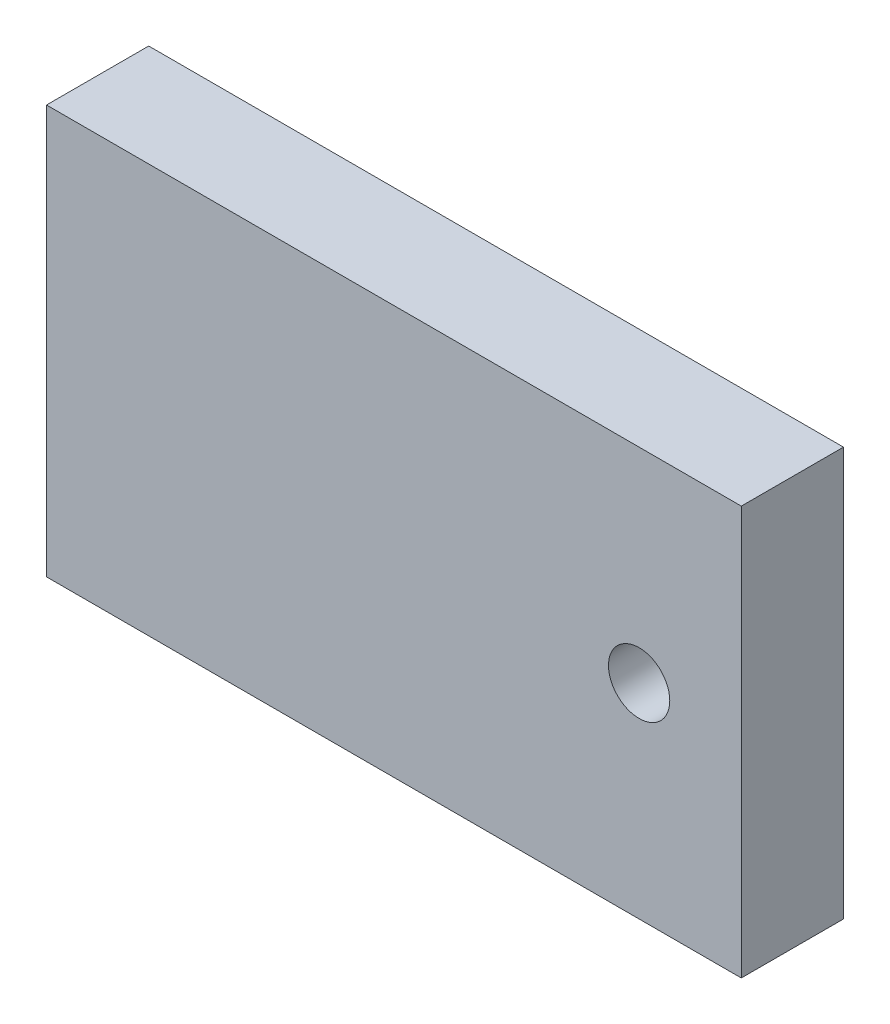
ISO-10303-21;
HEADER;
FILE_DESCRIPTION(('STEP AP214'),'2;1');
FILE_NAME('part.step','',(''),(''),'','','');
FILE_SCHEMA(('AUTOMOTIVE_DESIGN { 1 0 10303 214 1 1 1 1 }'));
ENDSEC;
DATA;
#1=APPLICATION_CONTEXT('core data for automotive mechanical design processes');
#2=APPLICATION_PROTOCOL_DEFINITION('international standard','automotive_design',2000,#1);
#3=PRODUCT_CONTEXT('',#1,'mechanical');
#4=PRODUCT('Part','Part','',(#3));
#5=PRODUCT_RELATED_PRODUCT_CATEGORY('part','',(#4));
#6=PRODUCT_DEFINITION_FORMATION('','',#4);
#7=PRODUCT_DEFINITION_CONTEXT('part definition',#1,'design');
#8=PRODUCT_DEFINITION('design','',#6,#7);
#9=PRODUCT_DEFINITION_SHAPE('','',#8);
#10=(LENGTH_UNIT() NAMED_UNIT(*) SI_UNIT(.MILLI.,.METRE.));
#11=(NAMED_UNIT(*) PLANE_ANGLE_UNIT() SI_UNIT($,.RADIAN.));
#12=(NAMED_UNIT(*) SI_UNIT($,.STERADIAN.) SOLID_ANGLE_UNIT());
#13=UNCERTAINTY_MEASURE_WITH_UNIT(LENGTH_MEASURE(1.E-05),#10,'distance_accuracy_value','');
#14=(GEOMETRIC_REPRESENTATION_CONTEXT(3) GLOBAL_UNCERTAINTY_ASSIGNED_CONTEXT((#13)) GLOBAL_UNIT_ASSIGNED_CONTEXT((#10,
#11,#12)) REPRESENTATION_CONTEXT('',''));
#15=CARTESIAN_POINT('',(0.,0.,0.));
#16=DIRECTION('',(0.,0.,1.));
#17=DIRECTION('',(1.,0.,0.));
#18=AXIS2_PLACEMENT_3D('',#15,#16,#17);
#19=CARTESIAN_POINT('',(0.,0.,5.));
#20=DIRECTION('',(0.,0.,-1.));
#21=DIRECTION('',(-1.,0.,0.));
#22=AXIS2_PLACEMENT_3D('',#19,#20,#21);
#23=PLANE('',#22);
#24=DIRECTION('',(0.,1.,0.));
#25=VECTOR('',#24,1.);
#26=CARTESIAN_POINT('',(-29.,-10.,5.));
#27=LINE('',#26,#25);
#28=CARTESIAN_POINT('',(-29.,-10.,5.));
#29=VERTEX_POINT('',#28);
#30=CARTESIAN_POINT('',(-29.,10.,5.));
#31=VERTEX_POINT('',#30);
#32=EDGE_CURVE('E113',#29,#31,#27,.T.);
#33=ORIENTED_EDGE('',*,*,#32,.F.);
#34=DIRECTION('',(1.,0.,0.));
#35=VECTOR('',#34,1.);
#36=CARTESIAN_POINT('',(-29.,-10.,5.));
#37=LINE('',#36,#35);
#38=CARTESIAN_POINT('',(5.,-10.,5.));
#39=VERTEX_POINT('',#38);
#40=EDGE_CURVE('E103',#29,#39,#37,.T.);
#41=ORIENTED_EDGE('',*,*,#40,.T.);
#42=DIRECTION('',(0.,1.,0.));
#43=VECTOR('',#42,1.);
#44=CARTESIAN_POINT('',(5.,-10.,5.));
#45=LINE('',#44,#43);
#46=CARTESIAN_POINT('',(5.,10.,5.));
#47=VERTEX_POINT('',#46);
#48=EDGE_CURVE('E98',#39,#47,#45,.T.);
#49=ORIENTED_EDGE('',*,*,#48,.T.);
#50=DIRECTION('',(1.,0.,0.));
#51=VECTOR('',#50,1.);
#52=CARTESIAN_POINT('',(-29.,10.,5.));
#53=LINE('',#52,#51);
#54=EDGE_CURVE('E102',#31,#47,#53,.T.);
#55=ORIENTED_EDGE('',*,*,#54,.F.);
#56=EDGE_LOOP('',(#33,#41,#49,#55));
#57=FACE_BOUND('',#56,.T.);
#58=CARTESIAN_POINT('',(0.,0.,5.));
#59=DIRECTION('',(0.,0.,1.));
#60=DIRECTION('',(1.,0.,0.));
#61=AXIS2_PLACEMENT_3D('',#58,#59,#60);
#62=CIRCLE('',#61,1.5);
#63=CARTESIAN_POINT('',(1.5,0.,5.));
#64=VERTEX_POINT('',#63);
#65=EDGE_CURVE('E123',#64,#64,#62,.T.);
#66=ORIENTED_EDGE('',*,*,#65,.F.);
#67=EDGE_LOOP('',(#66));
#68=FACE_BOUND('',#67,.T.);
#69=ADVANCED_FACE('F52',(#57,#68),#23,.F.);
#70=CARTESIAN_POINT('',(0.,0.,0.));
#71=DIRECTION('',(0.,0.,-1.));
#72=DIRECTION('',(-1.,0.,0.));
#73=AXIS2_PLACEMENT_3D('',#70,#71,#72);
#74=PLANE('',#73);
#75=DIRECTION('',(0.,1.,0.));
#76=VECTOR('',#75,1.);
#77=CARTESIAN_POINT('',(-29.,-10.,0.));
#78=LINE('',#77,#76);
#79=CARTESIAN_POINT('',(-29.,-10.,0.));
#80=VERTEX_POINT('',#79);
#81=CARTESIAN_POINT('',(-29.,10.,0.));
#82=VERTEX_POINT('',#81);
#83=EDGE_CURVE('E119',#80,#82,#78,.T.);
#84=ORIENTED_EDGE('',*,*,#83,.T.);
#85=DIRECTION('',(1.,0.,0.));
#86=VECTOR('',#85,1.);
#87=CARTESIAN_POINT('',(-29.,10.,0.));
#88=LINE('',#87,#86);
#89=CARTESIAN_POINT('',(5.,10.,0.));
#90=VERTEX_POINT('',#89);
#91=EDGE_CURVE('E122',#82,#90,#88,.T.);
#92=ORIENTED_EDGE('',*,*,#91,.T.);
#93=DIRECTION('',(0.,1.,0.));
#94=VECTOR('',#93,1.);
#95=CARTESIAN_POINT('',(5.,-10.,0.));
#96=LINE('',#95,#94);
#97=CARTESIAN_POINT('',(5.,-10.,0.));
#98=VERTEX_POINT('',#97);
#99=EDGE_CURVE('E110',#98,#90,#96,.T.);
#100=ORIENTED_EDGE('',*,*,#99,.F.);
#101=DIRECTION('',(1.,0.,0.));
#102=VECTOR('',#101,1.);
#103=CARTESIAN_POINT('',(-29.,-10.,0.));
#104=LINE('',#103,#102);
#105=EDGE_CURVE('E86',#80,#98,#104,.T.);
#106=ORIENTED_EDGE('',*,*,#105,.F.);
#107=EDGE_LOOP('',(#84,#92,#100,#106));
#108=FACE_BOUND('',#107,.T.);
#109=CARTESIAN_POINT('',(0.,0.,0.));
#110=DIRECTION('',(0.,0.,1.));
#111=DIRECTION('',(1.,0.,0.));
#112=AXIS2_PLACEMENT_3D('',#109,#110,#111);
#113=CIRCLE('',#112,1.5);
#114=CARTESIAN_POINT('',(1.5,0.,0.));
#115=VERTEX_POINT('',#114);
#116=EDGE_CURVE('E158',#115,#115,#113,.T.);
#117=ORIENTED_EDGE('',*,*,#116,.T.);
#118=EDGE_LOOP('',(#117));
#119=FACE_BOUND('',#118,.T.);
#120=ADVANCED_FACE('F128',(#108,#119),#74,.T.);
#121=CARTESIAN_POINT('',(-29.,-10.,5.));
#122=DIRECTION('',(-1.,0.,0.));
#123=DIRECTION('',(0.,0.,1.));
#124=AXIS2_PLACEMENT_3D('',#121,#122,#123);
#125=PLANE('',#124);
#126=ORIENTED_EDGE('',*,*,#83,.F.);
#127=DIRECTION('',(0.,0.,-1.));
#128=VECTOR('',#127,1.);
#129=CARTESIAN_POINT('',(-29.,-10.,5.));
#130=LINE('',#129,#128);
#131=EDGE_CURVE('E12',#29,#80,#130,.T.);
#132=ORIENTED_EDGE('',*,*,#131,.F.);
#133=ORIENTED_EDGE('',*,*,#32,.T.);
#134=DIRECTION('',(0.,0.,-1.));
#135=VECTOR('',#134,1.);
#136=CARTESIAN_POINT('',(-29.,10.,5.));
#137=LINE('',#136,#135);
#138=EDGE_CURVE('E56',#31,#82,#137,.T.);
#139=ORIENTED_EDGE('',*,*,#138,.T.);
#140=EDGE_LOOP('',(#126,#132,#133,#139));
#141=FACE_BOUND('',#140,.T.);
#142=ADVANCED_FACE('F54',(#141),#125,.T.);
#143=CARTESIAN_POINT('',(-29.,-10.,5.));
#144=DIRECTION('',(0.,1.,0.));
#145=DIRECTION('',(0.,0.,1.));
#146=AXIS2_PLACEMENT_3D('',#143,#144,#145);
#147=PLANE('',#146);
#148=ORIENTED_EDGE('',*,*,#105,.T.);
#149=DIRECTION('',(0.,0.,-1.));
#150=VECTOR('',#149,1.);
#151=CARTESIAN_POINT('',(5.,-10.,5.));
#152=LINE('',#151,#150);
#153=EDGE_CURVE('E62',#39,#98,#152,.T.);
#154=ORIENTED_EDGE('',*,*,#153,.F.);
#155=ORIENTED_EDGE('',*,*,#40,.F.);
#156=ORIENTED_EDGE('',*,*,#131,.T.);
#157=EDGE_LOOP('',(#148,#154,#155,#156));
#158=FACE_BOUND('',#157,.T.);
#159=ADVANCED_FACE('F131',(#158),#147,.F.);
#160=CARTESIAN_POINT('',(5.,-10.,5.));
#161=DIRECTION('',(-1.,0.,0.));
#162=DIRECTION('',(0.,-1.,0.));
#163=AXIS2_PLACEMENT_3D('',#160,#161,#162);
#164=PLANE('',#163);
#165=ORIENTED_EDGE('',*,*,#99,.T.);
#166=DIRECTION('',(0.,0.,-1.));
#167=VECTOR('',#166,1.);
#168=CARTESIAN_POINT('',(5.,10.,5.));
#169=LINE('',#168,#167);
#170=EDGE_CURVE('E107',#47,#90,#169,.T.);
#171=ORIENTED_EDGE('',*,*,#170,.F.);
#172=ORIENTED_EDGE('',*,*,#48,.F.);
#173=ORIENTED_EDGE('',*,*,#153,.T.);
#174=EDGE_LOOP('',(#165,#171,#172,#173));
#175=FACE_BOUND('',#174,.T.);
#176=ADVANCED_FACE('F108',(#175),#164,.F.);
#177=CARTESIAN_POINT('',(-29.,10.,5.));
#178=DIRECTION('',(0.,1.,0.));
#179=DIRECTION('',(0.,0.,1.));
#180=AXIS2_PLACEMENT_3D('',#177,#178,#179);
#181=PLANE('',#180);
#182=ORIENTED_EDGE('',*,*,#91,.F.);
#183=ORIENTED_EDGE('',*,*,#138,.F.);
#184=ORIENTED_EDGE('',*,*,#54,.T.);
#185=ORIENTED_EDGE('',*,*,#170,.T.);
#186=EDGE_LOOP('',(#182,#183,#184,#185));
#187=FACE_BOUND('',#186,.T.);
#188=ADVANCED_FACE('F112',(#187),#181,.T.);
#189=CARTESIAN_POINT('',(0.,0.,5.));
#190=DIRECTION('',(0.,0.,-1.));
#191=DIRECTION('',(-1.,0.,0.));
#192=AXIS2_PLACEMENT_3D('',#189,#190,#191);
#193=CYLINDRICAL_SURFACE('',#192,1.5);
#194=ORIENTED_EDGE('',*,*,#65,.T.);
#195=EDGE_LOOP('',(#194));
#196=FACE_BOUND('',#195,.T.);
#197=ORIENTED_EDGE('',*,*,#116,.F.);
#198=EDGE_LOOP('',(#197));
#199=FACE_BOUND('',#198,.T.);
#200=ADVANCED_FACE('F143',(#196,#199),#193,.F.);
#201=CLOSED_SHELL('',(#69,#120,#142,#159,#176,#188,#200));
#202=MANIFOLD_SOLID_BREP('B2',#201);
#203=ADVANCED_BREP_SHAPE_REPRESENTATION('',(#18,#202),#14);
#204=SHAPE_DEFINITION_REPRESENTATION(#9,#203);
ENDSEC;
END-ISO-10303-21;
